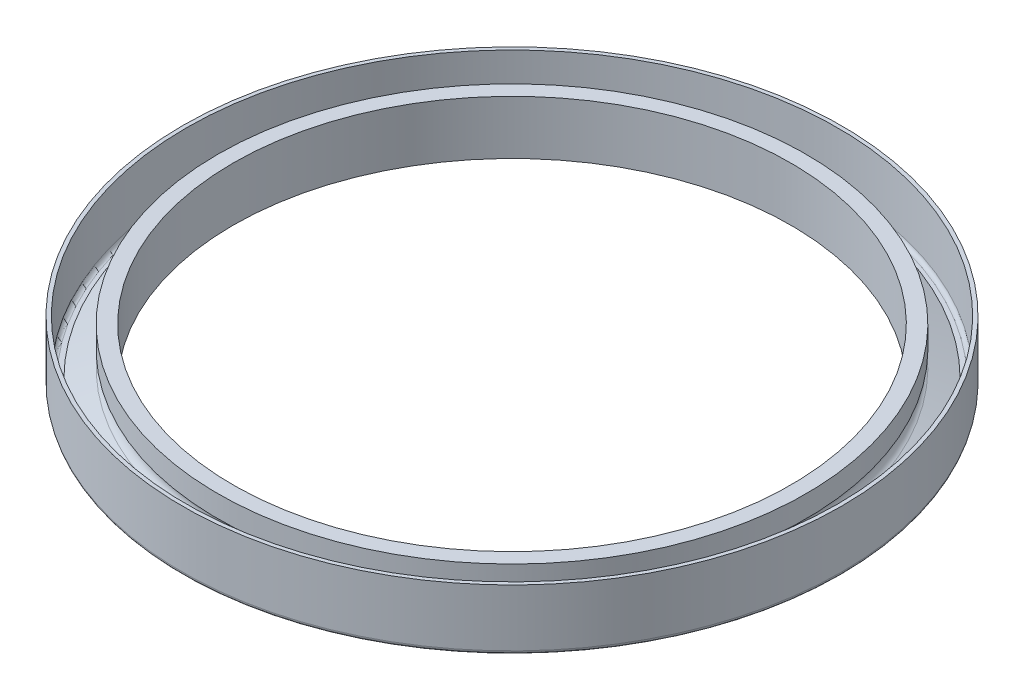
ISO-10303-21;
HEADER;
FILE_DESCRIPTION(('STEP AP214'),'2;1');
FILE_NAME('part.step','',(''),(''),'','','');
FILE_SCHEMA(('AUTOMOTIVE_DESIGN { 1 0 10303 214 1 1 1 1 }'));
ENDSEC;
DATA;
#1=APPLICATION_CONTEXT('core data for automotive mechanical design processes');
#2=APPLICATION_PROTOCOL_DEFINITION('international standard','automotive_design',2000,#1);
#3=PRODUCT_CONTEXT('',#1,'mechanical');
#4=PRODUCT('Part','Part','',(#3));
#5=PRODUCT_RELATED_PRODUCT_CATEGORY('part','',(#4));
#6=PRODUCT_DEFINITION_FORMATION('','',#4);
#7=PRODUCT_DEFINITION_CONTEXT('part definition',#1,'design');
#8=PRODUCT_DEFINITION('design','',#6,#7);
#9=PRODUCT_DEFINITION_SHAPE('','',#8);
#10=(LENGTH_UNIT() NAMED_UNIT(*) SI_UNIT(.MILLI.,.METRE.));
#11=(NAMED_UNIT(*) PLANE_ANGLE_UNIT() SI_UNIT($,.RADIAN.));
#12=(NAMED_UNIT(*) SI_UNIT($,.STERADIAN.) SOLID_ANGLE_UNIT());
#13=UNCERTAINTY_MEASURE_WITH_UNIT(LENGTH_MEASURE(1.E-05),#10,'distance_accuracy_value','');
#14=(GEOMETRIC_REPRESENTATION_CONTEXT(3) GLOBAL_UNCERTAINTY_ASSIGNED_CONTEXT((#13)) GLOBAL_UNIT_ASSIGNED_CONTEXT((#10,
#11,#12)) REPRESENTATION_CONTEXT('',''));
#15=CARTESIAN_POINT('',(0.,0.,0.));
#16=DIRECTION('',(0.,0.,1.));
#17=DIRECTION('',(1.,0.,0.));
#18=AXIS2_PLACEMENT_3D('',#15,#16,#17);
#19=CARTESIAN_POINT('',(0.,1.5,0.));
#20=DIRECTION('',(0.,1.,0.));
#21=DIRECTION('',(-1.,0.,0.));
#22=AXIS2_PLACEMENT_3D('',#19,#20,#21);
#23=TOROIDAL_SURFACE('',#22,63.5,0.75);
#24=CARTESIAN_POINT('',(0.,1.5,0.));
#25=DIRECTION('',(0.,1.,0.));
#26=DIRECTION('',(-1.,0.,0.));
#27=AXIS2_PLACEMENT_3D('',#24,#25,#26);
#28=CIRCLE('',#27,64.25);
#29=CARTESIAN_POINT('',(-64.25,1.49999999999999,0.));
#30=VERTEX_POINT('',#29);
#31=EDGE_CURVE('E55',#30,#30,#28,.T.);
#32=ORIENTED_EDGE('',*,*,#31,.T.);
#33=EDGE_LOOP('',(#32));
#34=FACE_BOUND('',#33,.T.);
#35=CARTESIAN_POINT('',(0.,0.75,0.));
#36=DIRECTION('',(0.,1.,0.));
#37=DIRECTION('',(-1.,0.,0.));
#38=AXIS2_PLACEMENT_3D('',#35,#36,#37);
#39=CIRCLE('',#38,63.5);
#40=CARTESIAN_POINT('',(-63.5,0.749999999999993,0.));
#41=VERTEX_POINT('',#40);
#42=EDGE_CURVE('E10',#41,#41,#39,.T.);
#43=ORIENTED_EDGE('',*,*,#42,.F.);
#44=EDGE_LOOP('',(#43));
#45=FACE_BOUND('',#44,.T.);
#46=ADVANCED_FACE('F15',(#34,#45),#23,.F.);
#47=CARTESIAN_POINT('',(-63.5,0.75,0.));
#48=DIRECTION('',(0.,1.,0.));
#49=DIRECTION('',(-1.,0.,0.));
#50=AXIS2_PLACEMENT_3D('',#47,#48,#49);
#51=PLANE('',#50);
#52=ORIENTED_EDGE('',*,*,#42,.T.);
#53=EDGE_LOOP('',(#52));
#54=FACE_BOUND('',#53,.T.);
#55=CARTESIAN_POINT('',(0.,0.75,0.));
#56=DIRECTION('',(0.,1.,0.));
#57=DIRECTION('',(-1.,0.,0.));
#58=AXIS2_PLACEMENT_3D('',#55,#56,#57);
#59=CIRCLE('',#58,62.5);
#60=CARTESIAN_POINT('',(-62.5,0.749999999999993,0.));
#61=VERTEX_POINT('',#60);
#62=EDGE_CURVE('E21',#61,#61,#59,.T.);
#63=ORIENTED_EDGE('',*,*,#62,.F.);
#64=EDGE_LOOP('',(#63));
#65=FACE_BOUND('',#64,.T.);
#66=ADVANCED_FACE('F82',(#54,#65),#51,.T.);
#67=CARTESIAN_POINT('',(0.,5.83619336924023,0.));
#68=DIRECTION('',(0.,1.,0.));
#69=DIRECTION('',(-1.,0.,0.));
#70=AXIS2_PLACEMENT_3D('',#67,#68,#69);
#71=CYLINDRICAL_SURFACE('',#70,62.5);
#72=ORIENTED_EDGE('',*,*,#62,.T.);
#73=EDGE_LOOP('',(#72));
#74=FACE_BOUND('',#73,.T.);
#75=CARTESIAN_POINT('',(0.,1.26428571428572,0.));
#76=DIRECTION('',(0.,1.,0.));
#77=DIRECTION('',(-1.,0.,0.));
#78=AXIS2_PLACEMENT_3D('',#75,#76,#77);
#79=CIRCLE('',#78,62.5);
#80=CARTESIAN_POINT('',(-62.5,1.26428571428571,0.));
#81=VERTEX_POINT('',#80);
#82=EDGE_CURVE('E25',#81,#81,#79,.T.);
#83=ORIENTED_EDGE('',*,*,#82,.F.);
#84=EDGE_LOOP('',(#83));
#85=FACE_BOUND('',#84,.T.);
#86=ADVANCED_FACE('F88',(#74,#85),#71,.T.);
#87=CARTESIAN_POINT('',(0.,3.15,0.));
#88=DIRECTION('',(0.,-1.,0.));
#89=DIRECTION('',(1.,0.,0.));
#90=AXIS2_PLACEMENT_3D('',#87,#88,#89);
#91=CONICAL_SURFACE('',#90,58.,1.17397818284434);
#92=ORIENTED_EDGE('',*,*,#82,.T.);
#93=EDGE_LOOP('',(#92));
#94=FACE_BOUND('',#93,.T.);
#95=CARTESIAN_POINT('',(0.,3.15,0.));
#96=DIRECTION('',(0.,1.,0.));
#97=DIRECTION('',(-1.,0.,0.));
#98=AXIS2_PLACEMENT_3D('',#95,#96,#97);
#99=CIRCLE('',#98,58.);
#100=CARTESIAN_POINT('',(-58.,3.14999999999999,0.));
#101=VERTEX_POINT('',#100);
#102=EDGE_CURVE('E29',#101,#101,#99,.T.);
#103=ORIENTED_EDGE('',*,*,#102,.F.);
#104=EDGE_LOOP('',(#103));
#105=FACE_BOUND('',#104,.T.);
#106=ADVANCED_FACE('F182',(#94,#105),#91,.T.);
#107=CARTESIAN_POINT('',(0.,4.74642857142858,0.));
#108=DIRECTION('',(0.,1.,0.));
#109=DIRECTION('',(-1.,0.,0.));
#110=AXIS2_PLACEMENT_3D('',#107,#108,#109);
#111=TOROIDAL_SURFACE('',#110,58.6689795918367,1.73092977268505);
#112=ORIENTED_EDGE('',*,*,#102,.T.);
#113=EDGE_LOOP('',(#112));
#114=FACE_BOUND('',#113,.T.);
#115=CARTESIAN_POINT('',(0.,6.34285714285715,0.));
#116=DIRECTION('',(0.,1.,0.));
#117=DIRECTION('',(-1.,0.,0.));
#118=AXIS2_PLACEMENT_3D('',#115,#116,#117);
#119=CIRCLE('',#118,58.);
#120=CARTESIAN_POINT('',(-58.,6.34285714285714,0.));
#121=VERTEX_POINT('',#120);
#122=EDGE_CURVE('E34',#121,#121,#119,.T.);
#123=ORIENTED_EDGE('',*,*,#122,.F.);
#124=EDGE_LOOP('',(#123));
#125=FACE_BOUND('',#124,.T.);
#126=ADVANCED_FACE('F78',(#114,#125),#111,.F.);
#127=CARTESIAN_POINT('',(0.,5.83619336924023,0.));
#128=DIRECTION('',(0.,1.,0.));
#129=DIRECTION('',(-1.,0.,0.));
#130=AXIS2_PLACEMENT_3D('',#127,#128,#129);
#131=CYLINDRICAL_SURFACE('',#130,58.);
#132=ORIENTED_EDGE('',*,*,#122,.T.);
#133=EDGE_LOOP('',(#132));
#134=FACE_BOUND('',#133,.T.);
#135=CARTESIAN_POINT('',(0.,10.6285714285714,0.));
#136=DIRECTION('',(0.,1.,0.));
#137=DIRECTION('',(-1.,0.,0.));
#138=AXIS2_PLACEMENT_3D('',#135,#136,#137);
#139=CIRCLE('',#138,58.);
#140=CARTESIAN_POINT('',(-58.,10.6285714285714,0.));
#141=VERTEX_POINT('',#140);
#142=EDGE_CURVE('E37',#141,#141,#139,.T.);
#143=ORIENTED_EDGE('',*,*,#142,.F.);
#144=EDGE_LOOP('',(#143));
#145=FACE_BOUND('',#144,.T.);
#146=ADVANCED_FACE('F66',(#134,#145),#131,.T.);
#147=CARTESIAN_POINT('',(-55.,10.6285714285714,0.));
#148=DIRECTION('',(0.,1.,0.));
#149=DIRECTION('',(-1.,0.,0.));
#150=AXIS2_PLACEMENT_3D('',#147,#148,#149);
#151=PLANE('',#150);
#152=ORIENTED_EDGE('',*,*,#142,.T.);
#153=EDGE_LOOP('',(#152));
#154=FACE_BOUND('',#153,.T.);
#155=CARTESIAN_POINT('',(0.,10.6285714285714,0.));
#156=DIRECTION('',(0.,1.,0.));
#157=DIRECTION('',(-1.,0.,0.));
#158=AXIS2_PLACEMENT_3D('',#155,#156,#157);
#159=CIRCLE('',#158,55.);
#160=CARTESIAN_POINT('',(-55.,10.6285714285714,0.));
#161=VERTEX_POINT('',#160);
#162=EDGE_CURVE('E58',#161,#161,#159,.T.);
#163=ORIENTED_EDGE('',*,*,#162,.F.);
#164=EDGE_LOOP('',(#163));
#165=FACE_BOUND('',#164,.T.);
#166=ADVANCED_FACE('F64',(#154,#165),#151,.T.);
#167=CARTESIAN_POINT('',(0.,5.83619336924023,0.));
#168=DIRECTION('',(0.,1.,0.));
#169=DIRECTION('',(-1.,0.,0.));
#170=AXIS2_PLACEMENT_3D('',#167,#168,#169);
#171=CYLINDRICAL_SURFACE('',#170,55.);
#172=CARTESIAN_POINT('',(0.,0.,0.));
#173=DIRECTION('',(0.,1.,0.));
#174=DIRECTION('',(-1.,0.,0.));
#175=AXIS2_PLACEMENT_3D('',#172,#173,#174);
#176=CIRCLE('',#175,55.);
#177=CARTESIAN_POINT('',(-55.,0.,0.));
#178=VERTEX_POINT('',#177);
#179=EDGE_CURVE('E40',#178,#178,#176,.T.);
#180=ORIENTED_EDGE('',*,*,#179,.F.);
#181=EDGE_LOOP('',(#180));
#182=FACE_BOUND('',#181,.T.);
#183=ORIENTED_EDGE('',*,*,#162,.T.);
#184=EDGE_LOOP('',(#183));
#185=FACE_BOUND('',#184,.T.);
#186=ADVANCED_FACE('F62',(#182,#185),#171,.F.);
#187=CARTESIAN_POINT('',(-64.25,0.,0.));
#188=DIRECTION('',(0.,-1.,0.));
#189=DIRECTION('',(1.,0.,0.));
#190=AXIS2_PLACEMENT_3D('',#187,#188,#189);
#191=PLANE('',#190);
#192=ORIENTED_EDGE('',*,*,#179,.T.);
#193=EDGE_LOOP('',(#192));
#194=FACE_BOUND('',#193,.T.);
#195=CARTESIAN_POINT('',(0.,0.,0.));
#196=DIRECTION('',(0.,1.,0.));
#197=DIRECTION('',(-1.,0.,0.));
#198=AXIS2_PLACEMENT_3D('',#195,#196,#197);
#199=CIRCLE('',#198,64.25);
#200=CARTESIAN_POINT('',(-64.25,0.,0.));
#201=VERTEX_POINT('',#200);
#202=EDGE_CURVE('E43',#201,#201,#199,.T.);
#203=ORIENTED_EDGE('',*,*,#202,.F.);
#204=EDGE_LOOP('',(#203));
#205=FACE_BOUND('',#204,.T.);
#206=ADVANCED_FACE('F75',(#194,#205),#191,.T.);
#207=CARTESIAN_POINT('',(0.,0.75,0.));
#208=DIRECTION('',(0.,1.,0.));
#209=DIRECTION('',(-1.,0.,0.));
#210=AXIS2_PLACEMENT_3D('',#207,#208,#209);
#211=TOROIDAL_SURFACE('',#210,64.25,0.75);
#212=ORIENTED_EDGE('',*,*,#202,.T.);
#213=EDGE_LOOP('',(#212));
#214=FACE_BOUND('',#213,.T.);
#215=CARTESIAN_POINT('',(0.,0.75,0.));
#216=DIRECTION('',(0.,1.,0.));
#217=DIRECTION('',(-1.,0.,0.));
#218=AXIS2_PLACEMENT_3D('',#215,#216,#217);
#219=CIRCLE('',#218,65.);
#220=CARTESIAN_POINT('',(-65.,0.749999999999993,0.));
#221=VERTEX_POINT('',#220);
#222=EDGE_CURVE('E46',#221,#221,#219,.T.);
#223=ORIENTED_EDGE('',*,*,#222,.F.);
#224=EDGE_LOOP('',(#223));
#225=FACE_BOUND('',#224,.T.);
#226=ADVANCED_FACE('F107',(#214,#225),#211,.T.);
#227=CARTESIAN_POINT('',(0.,5.83619336924023,0.));
#228=DIRECTION('',(0.,1.,0.));
#229=DIRECTION('',(-1.,0.,0.));
#230=AXIS2_PLACEMENT_3D('',#227,#228,#229);
#231=CYLINDRICAL_SURFACE('',#230,65.);
#232=ORIENTED_EDGE('',*,*,#222,.T.);
#233=EDGE_LOOP('',(#232));
#234=FACE_BOUND('',#233,.T.);
#235=CARTESIAN_POINT('',(0.,12.,0.));
#236=DIRECTION('',(0.,1.,0.));
#237=DIRECTION('',(-1.,0.,0.));
#238=AXIS2_PLACEMENT_3D('',#235,#236,#237);
#239=CIRCLE('',#238,65.);
#240=CARTESIAN_POINT('',(-65.,12.,0.));
#241=VERTEX_POINT('',#240);
#242=EDGE_CURVE('E49',#241,#241,#239,.T.);
#243=ORIENTED_EDGE('',*,*,#242,.F.);
#244=EDGE_LOOP('',(#243));
#245=FACE_BOUND('',#244,.T.);
#246=ADVANCED_FACE('F101',(#234,#245),#231,.T.);
#247=CARTESIAN_POINT('',(-64.25,12.,0.));
#248=DIRECTION('',(0.,1.,0.));
#249=DIRECTION('',(-1.,0.,0.));
#250=AXIS2_PLACEMENT_3D('',#247,#248,#249);
#251=PLANE('',#250);
#252=ORIENTED_EDGE('',*,*,#242,.T.);
#253=EDGE_LOOP('',(#252));
#254=FACE_BOUND('',#253,.T.);
#255=CARTESIAN_POINT('',(0.,12.,0.));
#256=DIRECTION('',(0.,1.,0.));
#257=DIRECTION('',(-1.,0.,0.));
#258=AXIS2_PLACEMENT_3D('',#255,#256,#257);
#259=CIRCLE('',#258,64.25);
#260=CARTESIAN_POINT('',(-64.25,12.,0.));
#261=VERTEX_POINT('',#260);
#262=EDGE_CURVE('E52',#261,#261,#259,.T.);
#263=ORIENTED_EDGE('',*,*,#262,.F.);
#264=EDGE_LOOP('',(#263));
#265=FACE_BOUND('',#264,.T.);
#266=ADVANCED_FACE('F94',(#254,#265),#251,.T.);
#267=CARTESIAN_POINT('',(0.,5.83619336924023,0.));
#268=DIRECTION('',(0.,1.,0.));
#269=DIRECTION('',(-1.,0.,0.));
#270=AXIS2_PLACEMENT_3D('',#267,#268,#269);
#271=CYLINDRICAL_SURFACE('',#270,64.25);
#272=ORIENTED_EDGE('',*,*,#262,.T.);
#273=EDGE_LOOP('',(#272));
#274=FACE_BOUND('',#273,.T.);
#275=ORIENTED_EDGE('',*,*,#31,.F.);
#276=EDGE_LOOP('',(#275));
#277=FACE_BOUND('',#276,.T.);
#278=ADVANCED_FACE('F92',(#274,#277),#271,.F.);
#279=CLOSED_SHELL('',(#46,#66,#86,#106,#126,#146,#166,#186,#206,#226,#246,#266,#278));
#280=MANIFOLD_SOLID_BREP('B1',#279);
#281=ADVANCED_BREP_SHAPE_REPRESENTATION('',(#18,#280),#14);
#282=SHAPE_DEFINITION_REPRESENTATION(#9,#281);
ENDSEC;
END-ISO-10303-21;
